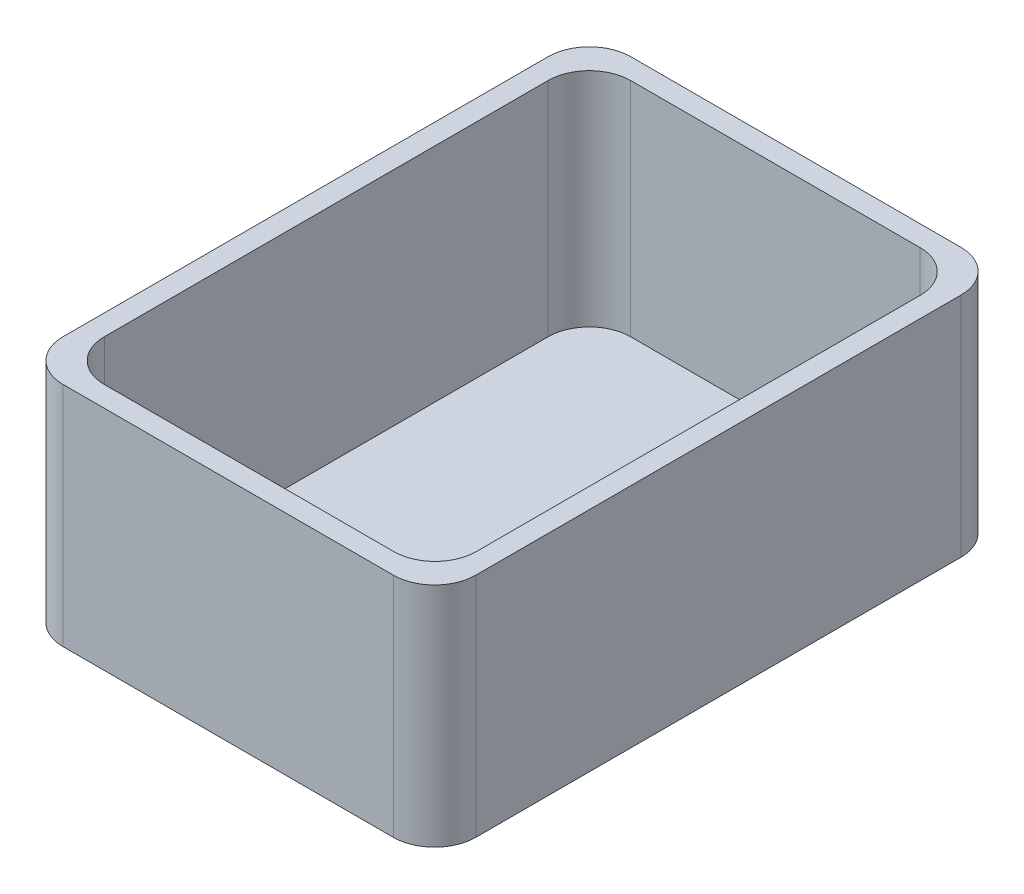
ISO-10303-21;
HEADER;
FILE_DESCRIPTION(('STEP AP214'),'2;1');
FILE_NAME('part.step','',(''),(''),'','','');
FILE_SCHEMA(('AUTOMOTIVE_DESIGN { 1 0 10303 214 1 1 1 1 }'));
ENDSEC;
DATA;
#1=APPLICATION_CONTEXT('core data for automotive mechanical design processes');
#2=APPLICATION_PROTOCOL_DEFINITION('international standard','automotive_design',2000,#1);
#3=PRODUCT_CONTEXT('',#1,'mechanical');
#4=PRODUCT('Part','Part','',(#3));
#5=PRODUCT_RELATED_PRODUCT_CATEGORY('part','',(#4));
#6=PRODUCT_DEFINITION_FORMATION('','',#4);
#7=PRODUCT_DEFINITION_CONTEXT('part definition',#1,'design');
#8=PRODUCT_DEFINITION('design','',#6,#7);
#9=PRODUCT_DEFINITION_SHAPE('','',#8);
#10=(LENGTH_UNIT() NAMED_UNIT(*) SI_UNIT(.MILLI.,.METRE.));
#11=(NAMED_UNIT(*) PLANE_ANGLE_UNIT() SI_UNIT($,.RADIAN.));
#12=(NAMED_UNIT(*) SI_UNIT($,.STERADIAN.) SOLID_ANGLE_UNIT());
#13=UNCERTAINTY_MEASURE_WITH_UNIT(LENGTH_MEASURE(1.E-05),#10,'distance_accuracy_value','');
#14=(GEOMETRIC_REPRESENTATION_CONTEXT(3) GLOBAL_UNCERTAINTY_ASSIGNED_CONTEXT((#13)) GLOBAL_UNIT_ASSIGNED_CONTEXT((#10,
#11,#12)) REPRESENTATION_CONTEXT('',''));
#15=CARTESIAN_POINT('',(0.,0.,0.));
#16=DIRECTION('',(0.,0.,1.));
#17=DIRECTION('',(1.,0.,0.));
#18=AXIS2_PLACEMENT_3D('',#15,#16,#17);
#19=CARTESIAN_POINT('',(0.,220.,0.));
#20=DIRECTION('',(0.,1.,0.));
#21=DIRECTION('',(0.,0.,1.));
#22=AXIS2_PLACEMENT_3D('',#19,#20,#21);
#23=PLANE('',#22);
#24=DIRECTION('',(-1.,0.,0.));
#25=VECTOR('',#24,1.);
#26=CARTESIAN_POINT('',(-200.,220.,-275.));
#27=LINE('',#26,#25);
#28=CARTESIAN_POINT('',(160.,220.,-275.));
#29=VERTEX_POINT('',#28);
#30=CARTESIAN_POINT('',(-160.,220.,-275.));
#31=VERTEX_POINT('',#30);
#32=EDGE_CURVE('E331',#29,#31,#27,.T.);
#33=ORIENTED_EDGE('',*,*,#32,.T.);
#34=CARTESIAN_POINT('',(-160.,220.,-235.));
#35=DIRECTION('',(0.,1.,0.));
#36=DIRECTION('',(0.,0.,1.));
#37=AXIS2_PLACEMENT_3D('',#34,#35,#36);
#38=CIRCLE('',#37,40.);
#39=CARTESIAN_POINT('',(-200.,220.,-235.));
#40=VERTEX_POINT('',#39);
#41=EDGE_CURVE('E221',#31,#40,#38,.T.);
#42=ORIENTED_EDGE('',*,*,#41,.T.);
#43=DIRECTION('',(0.,0.,1.));
#44=VECTOR('',#43,1.);
#45=CARTESIAN_POINT('',(-200.,220.,-275.));
#46=LINE('',#45,#44);
#47=CARTESIAN_POINT('',(-200.,220.,235.));
#48=VERTEX_POINT('',#47);
#49=EDGE_CURVE('E177',#40,#48,#46,.T.);
#50=ORIENTED_EDGE('',*,*,#49,.T.);
#51=CARTESIAN_POINT('',(-160.,220.,235.));
#52=DIRECTION('',(0.,1.,0.));
#53=DIRECTION('',(0.,0.,1.));
#54=AXIS2_PLACEMENT_3D('',#51,#52,#53);
#55=CIRCLE('',#54,40.);
#56=CARTESIAN_POINT('',(-160.,220.,275.));
#57=VERTEX_POINT('',#56);
#58=EDGE_CURVE('E215',#48,#57,#55,.T.);
#59=ORIENTED_EDGE('',*,*,#58,.T.);
#60=DIRECTION('',(1.,0.,0.));
#61=VECTOR('',#60,1.);
#62=CARTESIAN_POINT('',(-200.,220.,275.));
#63=LINE('',#62,#61);
#64=CARTESIAN_POINT('',(160.,220.,275.));
#65=VERTEX_POINT('',#64);
#66=EDGE_CURVE('E199',#57,#65,#63,.T.);
#67=ORIENTED_EDGE('',*,*,#66,.T.);
#68=CARTESIAN_POINT('',(160.,220.,235.));
#69=DIRECTION('',(0.,1.,0.));
#70=DIRECTION('',(0.,0.,1.));
#71=AXIS2_PLACEMENT_3D('',#68,#69,#70);
#72=CIRCLE('',#71,40.);
#73=CARTESIAN_POINT('',(200.,220.,235.));
#74=VERTEX_POINT('',#73);
#75=EDGE_CURVE('E212',#65,#74,#72,.T.);
#76=ORIENTED_EDGE('',*,*,#75,.T.);
#77=DIRECTION('',(0.,0.,-1.));
#78=VECTOR('',#77,1.);
#79=CARTESIAN_POINT('',(200.,220.,-275.));
#80=LINE('',#79,#78);
#81=CARTESIAN_POINT('',(200.,220.,-235.));
#82=VERTEX_POINT('',#81);
#83=EDGE_CURVE('E192',#74,#82,#80,.T.);
#84=ORIENTED_EDGE('',*,*,#83,.T.);
#85=CARTESIAN_POINT('',(160.,220.,-235.));
#86=DIRECTION('',(0.,1.,0.));
#87=DIRECTION('',(0.,0.,1.));
#88=AXIS2_PLACEMENT_3D('',#85,#86,#87);
#89=CIRCLE('',#88,40.);
#90=EDGE_CURVE('E218',#82,#29,#89,.T.);
#91=ORIENTED_EDGE('',*,*,#90,.T.);
#92=EDGE_LOOP('',(#33,#42,#50,#59,#67,#76,#84,#91));
#93=FACE_BOUND('',#92,.T.);
#94=DIRECTION('',(0.,0.,1.));
#95=VECTOR('',#94,1.);
#96=CARTESIAN_POINT('',(-180.,220.,0.));
#97=LINE('',#96,#95);
#98=CARTESIAN_POINT('',(-180.,220.,-214.949814820712));
#99=VERTEX_POINT('',#98);
#100=CARTESIAN_POINT('',(-180.,220.,215.));
#101=VERTEX_POINT('',#100);
#102=EDGE_CURVE('E286',#99,#101,#97,.T.);
#103=ORIENTED_EDGE('',*,*,#102,.F.);
#104=CARTESIAN_POINT('',(-140.,220.,-214.949814820712));
#105=DIRECTION('',(0.,1.,0.));
#106=DIRECTION('',(0.,0.,1.));
#107=AXIS2_PLACEMENT_3D('',#104,#105,#106);
#108=CIRCLE('',#107,40.);
#109=CARTESIAN_POINT('',(-140.,220.,-254.949814820712));
#110=VERTEX_POINT('',#109);
#111=EDGE_CURVE('E52',#99,#110,#108,.F.);
#112=ORIENTED_EDGE('',*,*,#111,.T.);
#113=DIRECTION('',(1.,0.,0.));
#114=VECTOR('',#113,1.);
#115=CARTESIAN_POINT('',(0.,220.,-254.949814820712));
#116=LINE('',#115,#114);
#117=CARTESIAN_POINT('',(140.460384802413,220.,-254.949814820712));
#118=VERTEX_POINT('',#117);
#119=EDGE_CURVE('E285',#110,#118,#116,.T.);
#120=ORIENTED_EDGE('',*,*,#119,.T.);
#121=CARTESIAN_POINT('',(140.460384802413,220.,-214.949814820712));
#122=DIRECTION('',(0.,1.,0.));
#123=DIRECTION('',(0.,0.,1.));
#124=AXIS2_PLACEMENT_3D('',#121,#122,#123);
#125=CIRCLE('',#124,40.);
#126=CARTESIAN_POINT('',(180.460384802413,220.,-214.949814820712));
#127=VERTEX_POINT('',#126);
#128=EDGE_CURVE('E277',#118,#127,#125,.F.);
#129=ORIENTED_EDGE('',*,*,#128,.T.);
#130=DIRECTION('',(0.,0.,1.));
#131=VECTOR('',#130,1.);
#132=CARTESIAN_POINT('',(180.460384802413,220.,0.));
#133=LINE('',#132,#131);
#134=CARTESIAN_POINT('',(180.460384802413,220.,215.));
#135=VERTEX_POINT('',#134);
#136=EDGE_CURVE('E293',#127,#135,#133,.T.);
#137=ORIENTED_EDGE('',*,*,#136,.T.);
#138=CARTESIAN_POINT('',(140.460384802413,220.,215.));
#139=DIRECTION('',(0.,1.,0.));
#140=DIRECTION('',(0.,0.,1.));
#141=AXIS2_PLACEMENT_3D('',#138,#139,#140);
#142=CIRCLE('',#141,40.);
#143=CARTESIAN_POINT('',(140.460384802413,220.,255.));
#144=VERTEX_POINT('',#143);
#145=EDGE_CURVE('E280',#135,#144,#142,.F.);
#146=ORIENTED_EDGE('',*,*,#145,.T.);
#147=DIRECTION('',(1.,0.,0.));
#148=VECTOR('',#147,1.);
#149=CARTESIAN_POINT('',(0.,220.,255.));
#150=LINE('',#149,#148);
#151=CARTESIAN_POINT('',(-140.,220.,255.));
#152=VERTEX_POINT('',#151);
#153=EDGE_CURVE('E324',#152,#144,#150,.T.);
#154=ORIENTED_EDGE('',*,*,#153,.F.);
#155=CARTESIAN_POINT('',(-140.,220.,215.));
#156=DIRECTION('',(0.,1.,0.));
#157=DIRECTION('',(0.,0.,1.));
#158=AXIS2_PLACEMENT_3D('',#155,#156,#157);
#159=CIRCLE('',#158,40.);
#160=EDGE_CURVE('E11',#152,#101,#159,.F.);
#161=ORIENTED_EDGE('',*,*,#160,.T.);
#162=EDGE_LOOP('',(#103,#112,#120,#129,#137,#146,#154,#161));
#163=FACE_BOUND('',#162,.T.);
#164=ADVANCED_FACE('F43',(#93,#163),#23,.T.);
#165=CARTESIAN_POINT('',(200.,220.,-275.));
#166=DIRECTION('',(-1.,0.,0.));
#167=DIRECTION('',(0.,0.,1.));
#168=AXIS2_PLACEMENT_3D('',#165,#166,#167);
#169=PLANE('',#168);
#170=DIRECTION('',(0.,0.,-1.));
#171=VECTOR('',#170,1.);
#172=CARTESIAN_POINT('',(200.,0.,-275.));
#173=LINE('',#172,#171);
#174=CARTESIAN_POINT('',(200.,0.,235.));
#175=VERTEX_POINT('',#174);
#176=CARTESIAN_POINT('',(200.,0.,-235.));
#177=VERTEX_POINT('',#176);
#178=EDGE_CURVE('E194',#175,#177,#173,.T.);
#179=ORIENTED_EDGE('',*,*,#178,.T.);
#180=DIRECTION('',(0.,-1.,0.));
#181=VECTOR('',#180,1.);
#182=CARTESIAN_POINT('',(200.,220.,-235.));
#183=LINE('',#182,#181);
#184=EDGE_CURVE('E228',#177,#82,#183,.F.);
#185=ORIENTED_EDGE('',*,*,#184,.T.);
#186=ORIENTED_EDGE('',*,*,#83,.F.);
#187=DIRECTION('',(0.,-1.,0.));
#188=VECTOR('',#187,1.);
#189=CARTESIAN_POINT('',(200.,220.,235.));
#190=LINE('',#189,#188);
#191=EDGE_CURVE('E224',#74,#175,#190,.T.);
#192=ORIENTED_EDGE('',*,*,#191,.T.);
#193=EDGE_LOOP('',(#179,#185,#186,#192));
#194=FACE_BOUND('',#193,.T.);
#195=ADVANCED_FACE('F344',(#194),#169,.F.);
#196=CARTESIAN_POINT('',(-200.,220.,-275.));
#197=DIRECTION('',(0.,0.,1.));
#198=DIRECTION('',(1.,0.,0.));
#199=AXIS2_PLACEMENT_3D('',#196,#197,#198);
#200=PLANE('',#199);
#201=DIRECTION('',(-1.,0.,0.));
#202=VECTOR('',#201,1.);
#203=CARTESIAN_POINT('',(-200.,0.,-275.));
#204=LINE('',#203,#202);
#205=CARTESIAN_POINT('',(160.,0.,-275.));
#206=VERTEX_POINT('',#205);
#207=CARTESIAN_POINT('',(-160.,0.,-275.));
#208=VERTEX_POINT('',#207);
#209=EDGE_CURVE('E187',#206,#208,#204,.T.);
#210=ORIENTED_EDGE('',*,*,#209,.T.);
#211=DIRECTION('',(0.,-1.,0.));
#212=VECTOR('',#211,1.);
#213=CARTESIAN_POINT('',(-160.,220.,-275.));
#214=LINE('',#213,#212);
#215=EDGE_CURVE('E161',#208,#31,#214,.F.);
#216=ORIENTED_EDGE('',*,*,#215,.T.);
#217=ORIENTED_EDGE('',*,*,#32,.F.);
#218=DIRECTION('',(0.,-1.,0.));
#219=VECTOR('',#218,1.);
#220=CARTESIAN_POINT('',(160.,220.,-275.));
#221=LINE('',#220,#219);
#222=EDGE_CURVE('E167',#29,#206,#221,.T.);
#223=ORIENTED_EDGE('',*,*,#222,.T.);
#224=EDGE_LOOP('',(#210,#216,#217,#223));
#225=FACE_BOUND('',#224,.T.);
#226=ADVANCED_FACE('F354',(#225),#200,.F.);
#227=CARTESIAN_POINT('',(-200.,220.,-275.));
#228=DIRECTION('',(1.,0.,0.));
#229=DIRECTION('',(0.,0.,-1.));
#230=AXIS2_PLACEMENT_3D('',#227,#228,#229);
#231=PLANE('',#230);
#232=ORIENTED_EDGE('',*,*,#49,.F.);
#233=DIRECTION('',(0.,-1.,0.));
#234=VECTOR('',#233,1.);
#235=CARTESIAN_POINT('',(-200.,220.,-235.));
#236=LINE('',#235,#234);
#237=CARTESIAN_POINT('',(-200.,0.,-235.));
#238=VERTEX_POINT('',#237);
#239=EDGE_CURVE('E160',#40,#238,#236,.T.);
#240=ORIENTED_EDGE('',*,*,#239,.T.);
#241=DIRECTION('',(0.,0.,1.));
#242=VECTOR('',#241,1.);
#243=CARTESIAN_POINT('',(-200.,0.,-275.));
#244=LINE('',#243,#242);
#245=CARTESIAN_POINT('',(-200.,0.,235.));
#246=VERTEX_POINT('',#245);
#247=EDGE_CURVE('E174',#238,#246,#244,.T.);
#248=ORIENTED_EDGE('',*,*,#247,.T.);
#249=DIRECTION('',(0.,-1.,0.));
#250=VECTOR('',#249,1.);
#251=CARTESIAN_POINT('',(-200.,220.,235.));
#252=LINE('',#251,#250);
#253=EDGE_CURVE('E180',#246,#48,#252,.F.);
#254=ORIENTED_EDGE('',*,*,#253,.T.);
#255=EDGE_LOOP('',(#232,#240,#248,#254));
#256=FACE_BOUND('',#255,.T.);
#257=ADVANCED_FACE('F173',(#256),#231,.F.);
#258=CARTESIAN_POINT('',(-200.,220.,275.));
#259=DIRECTION('',(0.,0.,-1.));
#260=DIRECTION('',(-1.,0.,0.));
#261=AXIS2_PLACEMENT_3D('',#258,#259,#260);
#262=PLANE('',#261);
#263=ORIENTED_EDGE('',*,*,#66,.F.);
#264=DIRECTION('',(0.,-1.,0.));
#265=VECTOR('',#264,1.);
#266=CARTESIAN_POINT('',(-160.,220.,275.));
#267=LINE('',#266,#265);
#268=CARTESIAN_POINT('',(-160.,0.,275.));
#269=VERTEX_POINT('',#268);
#270=EDGE_CURVE('E234',#57,#269,#267,.T.);
#271=ORIENTED_EDGE('',*,*,#270,.T.);
#272=DIRECTION('',(1.,0.,0.));
#273=VECTOR('',#272,1.);
#274=CARTESIAN_POINT('',(-200.,0.,275.));
#275=LINE('',#274,#273);
#276=CARTESIAN_POINT('',(160.,0.,275.));
#277=VERTEX_POINT('',#276);
#278=EDGE_CURVE('E186',#269,#277,#275,.T.);
#279=ORIENTED_EDGE('',*,*,#278,.T.);
#280=DIRECTION('',(0.,-1.,0.));
#281=VECTOR('',#280,1.);
#282=CARTESIAN_POINT('',(160.,220.,275.));
#283=LINE('',#282,#281);
#284=EDGE_CURVE('E231',#277,#65,#283,.F.);
#285=ORIENTED_EDGE('',*,*,#284,.T.);
#286=EDGE_LOOP('',(#263,#271,#279,#285));
#287=FACE_BOUND('',#286,.T.);
#288=ADVANCED_FACE('F361',(#287),#262,.F.);
#289=CARTESIAN_POINT('',(0.,0.,0.));
#290=DIRECTION('',(0.,1.,0.));
#291=DIRECTION('',(0.,0.,1.));
#292=AXIS2_PLACEMENT_3D('',#289,#290,#291);
#293=PLANE('',#292);
#294=ORIENTED_EDGE('',*,*,#247,.F.);
#295=CARTESIAN_POINT('',(-160.,0.,-235.));
#296=DIRECTION('',(0.,1.,0.));
#297=DIRECTION('',(0.,0.,1.));
#298=AXIS2_PLACEMENT_3D('',#295,#296,#297);
#299=CIRCLE('',#298,40.);
#300=EDGE_CURVE('E156',#238,#208,#299,.F.);
#301=ORIENTED_EDGE('',*,*,#300,.T.);
#302=ORIENTED_EDGE('',*,*,#209,.F.);
#303=CARTESIAN_POINT('',(160.,0.,-235.));
#304=DIRECTION('',(0.,1.,0.));
#305=DIRECTION('',(0.,0.,1.));
#306=AXIS2_PLACEMENT_3D('',#303,#304,#305);
#307=CIRCLE('',#306,40.);
#308=EDGE_CURVE('E168',#206,#177,#307,.F.);
#309=ORIENTED_EDGE('',*,*,#308,.T.);
#310=ORIENTED_EDGE('',*,*,#178,.F.);
#311=CARTESIAN_POINT('',(160.,0.,235.));
#312=DIRECTION('',(0.,1.,0.));
#313=DIRECTION('',(0.,0.,1.));
#314=AXIS2_PLACEMENT_3D('',#311,#312,#313);
#315=CIRCLE('',#314,40.);
#316=EDGE_CURVE('E179',#175,#277,#315,.F.);
#317=ORIENTED_EDGE('',*,*,#316,.T.);
#318=ORIENTED_EDGE('',*,*,#278,.F.);
#319=CARTESIAN_POINT('',(-160.,0.,235.));
#320=DIRECTION('',(0.,1.,0.));
#321=DIRECTION('',(0.,0.,1.));
#322=AXIS2_PLACEMENT_3D('',#319,#320,#321);
#323=CIRCLE('',#322,40.);
#324=EDGE_CURVE('E184',#269,#246,#323,.F.);
#325=ORIENTED_EDGE('',*,*,#324,.T.);
#326=EDGE_LOOP('',(#294,#301,#302,#309,#310,#317,#318,#325));
#327=FACE_BOUND('',#326,.T.);
#328=ADVANCED_FACE('F182',(#327),#293,.F.);
#329=CARTESIAN_POINT('',(180.460384802413,5.00000000000003,0.));
#330=DIRECTION('',(-1.,0.,0.));
#331=DIRECTION('',(0.,0.,1.));
#332=AXIS2_PLACEMENT_3D('',#329,#330,#331);
#333=PLANE('',#332);
#334=ORIENTED_EDGE('',*,*,#136,.F.);
#335=DIRECTION('',(0.,1.,0.));
#336=VECTOR('',#335,1.);
#337=CARTESIAN_POINT('',(180.460384802413,5.00000000000003,-214.949814820712));
#338=LINE('',#337,#336);
#339=CARTESIAN_POINT('',(180.460384802413,5.00000000000003,-214.949814820712));
#340=VERTEX_POINT('',#339);
#341=EDGE_CURVE('E249',#127,#340,#338,.F.);
#342=ORIENTED_EDGE('',*,*,#341,.T.);
#343=DIRECTION('',(0.,0.,1.));
#344=VECTOR('',#343,1.);
#345=CARTESIAN_POINT('',(180.460384802413,5.00000000000003,0.));
#346=LINE('',#345,#344);
#347=CARTESIAN_POINT('',(180.460384802413,5.00000000000003,215.));
#348=VERTEX_POINT('',#347);
#349=EDGE_CURVE('E315',#340,#348,#346,.T.);
#350=ORIENTED_EDGE('',*,*,#349,.T.);
#351=DIRECTION('',(0.,1.,0.));
#352=VECTOR('',#351,1.);
#353=CARTESIAN_POINT('',(180.460384802413,5.00000000000003,215.));
#354=LINE('',#353,#352);
#355=EDGE_CURVE('E245',#348,#135,#354,.T.);
#356=ORIENTED_EDGE('',*,*,#355,.T.);
#357=EDGE_LOOP('',(#334,#342,#350,#356));
#358=FACE_BOUND('',#357,.T.);
#359=ADVANCED_FACE('F370',(#358),#333,.T.);
#360=CARTESIAN_POINT('',(0.,5.00000000000003,255.));
#361=DIRECTION('',(0.,0.,1.));
#362=DIRECTION('',(1.,0.,0.));
#363=AXIS2_PLACEMENT_3D('',#360,#361,#362);
#364=PLANE('',#363);
#365=ORIENTED_EDGE('',*,*,#153,.T.);
#366=DIRECTION('',(0.,1.,0.));
#367=VECTOR('',#366,1.);
#368=CARTESIAN_POINT('',(140.460384802413,5.00000000000003,255.));
#369=LINE('',#368,#367);
#370=CARTESIAN_POINT('',(140.460384802413,5.00000000000003,255.));
#371=VERTEX_POINT('',#370);
#372=EDGE_CURVE('E268',#144,#371,#369,.F.);
#373=ORIENTED_EDGE('',*,*,#372,.T.);
#374=DIRECTION('',(1.,0.,0.));
#375=VECTOR('',#374,1.);
#376=CARTESIAN_POINT('',(0.,5.00000000000003,255.));
#377=LINE('',#376,#375);
#378=CARTESIAN_POINT('',(-140.,5.00000000000003,255.));
#379=VERTEX_POINT('',#378);
#380=EDGE_CURVE('E309',#379,#371,#377,.T.);
#381=ORIENTED_EDGE('',*,*,#380,.F.);
#382=DIRECTION('',(0.,1.,0.));
#383=VECTOR('',#382,1.);
#384=CARTESIAN_POINT('',(-140.,220.,255.));
#385=LINE('',#384,#383);
#386=EDGE_CURVE('E264',#379,#152,#385,.T.);
#387=ORIENTED_EDGE('',*,*,#386,.T.);
#388=EDGE_LOOP('',(#365,#373,#381,#387));
#389=FACE_BOUND('',#388,.T.);
#390=ADVANCED_FACE('F415',(#389),#364,.F.);
#391=CARTESIAN_POINT('',(-180.,5.00000000000003,0.));
#392=DIRECTION('',(-1.,0.,0.));
#393=DIRECTION('',(0.,0.,1.));
#394=AXIS2_PLACEMENT_3D('',#391,#392,#393);
#395=PLANE('',#394);
#396=DIRECTION('',(0.,0.,1.));
#397=VECTOR('',#396,1.);
#398=CARTESIAN_POINT('',(-180.,5.00000000000003,0.));
#399=LINE('',#398,#397);
#400=CARTESIAN_POINT('',(-180.,5.00000000000003,-214.949814820712));
#401=VERTEX_POINT('',#400);
#402=CARTESIAN_POINT('',(-180.,5.00000000000003,215.));
#403=VERTEX_POINT('',#402);
#404=EDGE_CURVE('E302',#401,#403,#399,.T.);
#405=ORIENTED_EDGE('',*,*,#404,.F.);
#406=DIRECTION('',(0.,1.,0.));
#407=VECTOR('',#406,1.);
#408=CARTESIAN_POINT('',(-180.,5.00000000000003,-214.949814820712));
#409=LINE('',#408,#407);
#410=EDGE_CURVE('E274',#401,#99,#409,.T.);
#411=ORIENTED_EDGE('',*,*,#410,.T.);
#412=ORIENTED_EDGE('',*,*,#102,.T.);
#413=DIRECTION('',(0.,1.,0.));
#414=VECTOR('',#413,1.);
#415=CARTESIAN_POINT('',(-180.,5.00000000000003,215.));
#416=LINE('',#415,#414);
#417=EDGE_CURVE('E271',#101,#403,#416,.F.);
#418=ORIENTED_EDGE('',*,*,#417,.T.);
#419=EDGE_LOOP('',(#405,#411,#412,#418));
#420=FACE_BOUND('',#419,.T.);
#421=ADVANCED_FACE('F306',(#420),#395,.F.);
#422=CARTESIAN_POINT('',(0.,5.00000000000003,-254.949814820712));
#423=DIRECTION('',(0.,0.,1.));
#424=DIRECTION('',(1.,0.,0.));
#425=AXIS2_PLACEMENT_3D('',#422,#423,#424);
#426=PLANE('',#425);
#427=DIRECTION('',(1.,0.,0.));
#428=VECTOR('',#427,1.);
#429=CARTESIAN_POINT('',(0.,5.00000000000003,-254.949814820712));
#430=LINE('',#429,#428);
#431=CARTESIAN_POINT('',(-140.,5.00000000000003,-254.949814820712));
#432=VERTEX_POINT('',#431);
#433=CARTESIAN_POINT('',(140.460384802413,5.00000000000003,-254.949814820712));
#434=VERTEX_POINT('',#433);
#435=EDGE_CURVE('E304',#432,#434,#430,.T.);
#436=ORIENTED_EDGE('',*,*,#435,.T.);
#437=DIRECTION('',(0.,1.,0.));
#438=VECTOR('',#437,1.);
#439=CARTESIAN_POINT('',(140.460384802413,220.,-254.949814820712));
#440=LINE('',#439,#438);
#441=EDGE_CURVE('E241',#434,#118,#440,.T.);
#442=ORIENTED_EDGE('',*,*,#441,.T.);
#443=ORIENTED_EDGE('',*,*,#119,.F.);
#444=DIRECTION('',(0.,1.,0.));
#445=VECTOR('',#444,1.);
#446=CARTESIAN_POINT('',(-140.,5.00000000000003,-254.949814820712));
#447=LINE('',#446,#445);
#448=EDGE_CURVE('E238',#110,#432,#447,.F.);
#449=ORIENTED_EDGE('',*,*,#448,.T.);
#450=EDGE_LOOP('',(#436,#442,#443,#449));
#451=FACE_BOUND('',#450,.T.);
#452=ADVANCED_FACE('F289',(#451),#426,.T.);
#453=CARTESIAN_POINT('',(0.,5.00000000000003,0.));
#454=DIRECTION('',(0.,1.,0.));
#455=DIRECTION('',(0.,0.,1.));
#456=AXIS2_PLACEMENT_3D('',#453,#454,#455);
#457=PLANE('',#456);
#458=ORIENTED_EDGE('',*,*,#349,.F.);
#459=CARTESIAN_POINT('',(140.460384802413,5.00000000000003,-214.949814820712));
#460=DIRECTION('',(0.,1.,0.));
#461=DIRECTION('',(0.,0.,1.));
#462=AXIS2_PLACEMENT_3D('',#459,#460,#461);
#463=CIRCLE('',#462,40.);
#464=EDGE_CURVE('E261',#340,#434,#463,.T.);
#465=ORIENTED_EDGE('',*,*,#464,.T.);
#466=ORIENTED_EDGE('',*,*,#435,.F.);
#467=CARTESIAN_POINT('',(-140.,5.00000000000003,-214.949814820712));
#468=DIRECTION('',(0.,1.,0.));
#469=DIRECTION('',(0.,0.,1.));
#470=AXIS2_PLACEMENT_3D('',#467,#468,#469);
#471=CIRCLE('',#470,40.);
#472=EDGE_CURVE('E255',#432,#401,#471,.T.);
#473=ORIENTED_EDGE('',*,*,#472,.T.);
#474=ORIENTED_EDGE('',*,*,#404,.T.);
#475=CARTESIAN_POINT('',(-140.,5.00000000000003,215.));
#476=DIRECTION('',(0.,1.,0.));
#477=DIRECTION('',(0.,0.,1.));
#478=AXIS2_PLACEMENT_3D('',#475,#476,#477);
#479=CIRCLE('',#478,40.);
#480=EDGE_CURVE('E252',#403,#379,#479,.T.);
#481=ORIENTED_EDGE('',*,*,#480,.T.);
#482=ORIENTED_EDGE('',*,*,#380,.T.);
#483=CARTESIAN_POINT('',(140.460384802413,5.00000000000003,215.));
#484=DIRECTION('',(0.,1.,0.));
#485=DIRECTION('',(0.,0.,1.));
#486=AXIS2_PLACEMENT_3D('',#483,#484,#485);
#487=CIRCLE('',#486,40.);
#488=EDGE_CURVE('E258',#371,#348,#487,.T.);
#489=ORIENTED_EDGE('',*,*,#488,.T.);
#490=EDGE_LOOP('',(#458,#465,#466,#473,#474,#481,#482,#489));
#491=FACE_BOUND('',#490,.T.);
#492=ADVANCED_FACE('F301',(#491),#457,.T.);
#493=CARTESIAN_POINT('',(-160.,220.,-235.));
#494=DIRECTION('',(0.,-1.,0.));
#495=DIRECTION('',(0.,0.,-1.));
#496=AXIS2_PLACEMENT_3D('',#493,#494,#495);
#497=CYLINDRICAL_SURFACE('',#496,40.);
#498=ORIENTED_EDGE('',*,*,#41,.F.);
#499=ORIENTED_EDGE('',*,*,#215,.F.);
#500=ORIENTED_EDGE('',*,*,#300,.F.);
#501=ORIENTED_EDGE('',*,*,#239,.F.);
#502=EDGE_LOOP('',(#498,#499,#500,#501));
#503=FACE_BOUND('',#502,.T.);
#504=ADVANCED_FACE('F159',(#503),#497,.T.);
#505=CARTESIAN_POINT('',(160.,220.,-235.));
#506=DIRECTION('',(0.,-1.,0.));
#507=DIRECTION('',(0.,0.,-1.));
#508=AXIS2_PLACEMENT_3D('',#505,#506,#507);
#509=CYLINDRICAL_SURFACE('',#508,40.);
#510=ORIENTED_EDGE('',*,*,#90,.F.);
#511=ORIENTED_EDGE('',*,*,#184,.F.);
#512=ORIENTED_EDGE('',*,*,#308,.F.);
#513=ORIENTED_EDGE('',*,*,#222,.F.);
#514=EDGE_LOOP('',(#510,#511,#512,#513));
#515=FACE_BOUND('',#514,.T.);
#516=ADVANCED_FACE('F349',(#515),#509,.T.);
#517=CARTESIAN_POINT('',(-160.,220.,235.));
#518=DIRECTION('',(0.,-1.,0.));
#519=DIRECTION('',(0.,0.,-1.));
#520=AXIS2_PLACEMENT_3D('',#517,#518,#519);
#521=CYLINDRICAL_SURFACE('',#520,40.);
#522=ORIENTED_EDGE('',*,*,#58,.F.);
#523=ORIENTED_EDGE('',*,*,#253,.F.);
#524=ORIENTED_EDGE('',*,*,#324,.F.);
#525=ORIENTED_EDGE('',*,*,#270,.F.);
#526=EDGE_LOOP('',(#522,#523,#524,#525));
#527=FACE_BOUND('',#526,.T.);
#528=ADVANCED_FACE('F384',(#527),#521,.T.);
#529=CARTESIAN_POINT('',(160.,220.,235.));
#530=DIRECTION('',(0.,-1.,0.));
#531=DIRECTION('',(0.,0.,-1.));
#532=AXIS2_PLACEMENT_3D('',#529,#530,#531);
#533=CYLINDRICAL_SURFACE('',#532,40.);
#534=ORIENTED_EDGE('',*,*,#75,.F.);
#535=ORIENTED_EDGE('',*,*,#284,.F.);
#536=ORIENTED_EDGE('',*,*,#316,.F.);
#537=ORIENTED_EDGE('',*,*,#191,.F.);
#538=EDGE_LOOP('',(#534,#535,#536,#537));
#539=FACE_BOUND('',#538,.T.);
#540=ADVANCED_FACE('F386',(#539),#533,.T.);
#541=CARTESIAN_POINT('',(140.460384802413,5.00000000000003,-214.949814820712));
#542=DIRECTION('',(0.,-1.,0.));
#543=DIRECTION('',(0.,0.,-1.));
#544=AXIS2_PLACEMENT_3D('',#541,#542,#543);
#545=CYLINDRICAL_SURFACE('',#544,40.);
#546=ORIENTED_EDGE('',*,*,#464,.F.);
#547=ORIENTED_EDGE('',*,*,#341,.F.);
#548=ORIENTED_EDGE('',*,*,#128,.F.);
#549=ORIENTED_EDGE('',*,*,#441,.F.);
#550=EDGE_LOOP('',(#546,#547,#548,#549));
#551=FACE_BOUND('',#550,.T.);
#552=ADVANCED_FACE('F392',(#551),#545,.F.);
#553=CARTESIAN_POINT('',(140.460384802413,5.00000000000003,215.));
#554=DIRECTION('',(0.,1.,0.));
#555=DIRECTION('',(0.,0.,1.));
#556=AXIS2_PLACEMENT_3D('',#553,#554,#555);
#557=CYLINDRICAL_SURFACE('',#556,40.);
#558=ORIENTED_EDGE('',*,*,#488,.F.);
#559=ORIENTED_EDGE('',*,*,#372,.F.);
#560=ORIENTED_EDGE('',*,*,#145,.F.);
#561=ORIENTED_EDGE('',*,*,#355,.F.);
#562=EDGE_LOOP('',(#558,#559,#560,#561));
#563=FACE_BOUND('',#562,.T.);
#564=ADVANCED_FACE('F400',(#563),#557,.F.);
#565=CARTESIAN_POINT('',(-140.,5.00000000000003,-214.949814820712));
#566=DIRECTION('',(0.,1.,0.));
#567=DIRECTION('',(0.,0.,1.));
#568=AXIS2_PLACEMENT_3D('',#565,#566,#567);
#569=CYLINDRICAL_SURFACE('',#568,40.);
#570=ORIENTED_EDGE('',*,*,#472,.F.);
#571=ORIENTED_EDGE('',*,*,#448,.F.);
#572=ORIENTED_EDGE('',*,*,#111,.F.);
#573=ORIENTED_EDGE('',*,*,#410,.F.);
#574=EDGE_LOOP('',(#570,#571,#572,#573));
#575=FACE_BOUND('',#574,.T.);
#576=ADVANCED_FACE('F296',(#575),#569,.F.);
#577=CARTESIAN_POINT('',(-140.,5.00000000000003,215.));
#578=DIRECTION('',(0.,-1.,0.));
#579=DIRECTION('',(0.,0.,-1.));
#580=AXIS2_PLACEMENT_3D('',#577,#578,#579);
#581=CYLINDRICAL_SURFACE('',#580,40.);
#582=ORIENTED_EDGE('',*,*,#480,.F.);
#583=ORIENTED_EDGE('',*,*,#417,.F.);
#584=ORIENTED_EDGE('',*,*,#160,.F.);
#585=ORIENTED_EDGE('',*,*,#386,.F.);
#586=EDGE_LOOP('',(#582,#583,#584,#585));
#587=FACE_BOUND('',#586,.T.);
#588=ADVANCED_FACE('F45',(#587),#581,.F.);
#589=CLOSED_SHELL('',(#164,#195,#226,#257,#288,#328,#359,#390,#421,#452,#492,#504,#516,#528,
#540,#552,#564,#576,#588));
#590=MANIFOLD_SOLID_BREP('B2',#589);
#591=ADVANCED_BREP_SHAPE_REPRESENTATION('',(#18,#590),#14);
#592=SHAPE_DEFINITION_REPRESENTATION(#9,#591);
ENDSEC;
END-ISO-10303-21;
